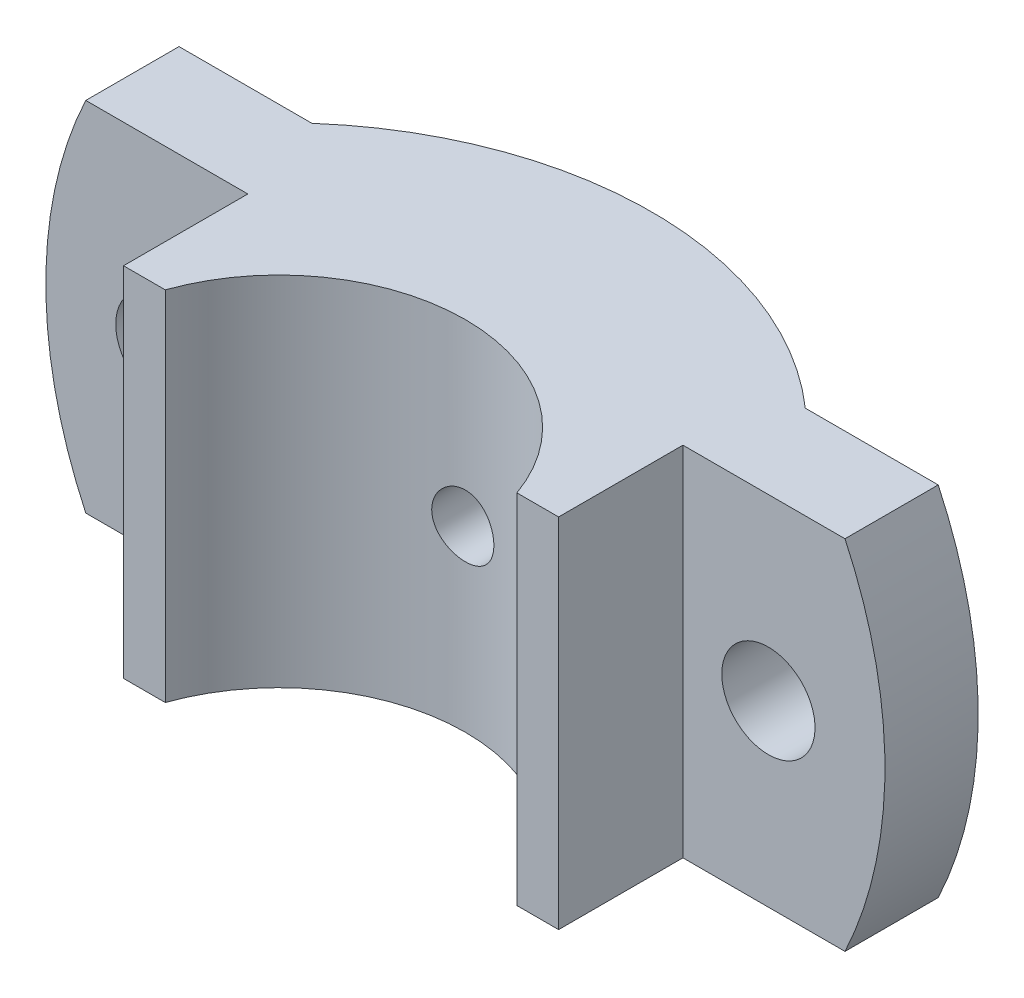
ISO-10303-21;
HEADER;
FILE_DESCRIPTION(('STEP AP214'),'2;1');
FILE_NAME('part.step','',(''),(''),'','','');
FILE_SCHEMA(('AUTOMOTIVE_DESIGN { 1 0 10303 214 1 1 1 1 }'));
ENDSEC;
DATA;
#1=APPLICATION_CONTEXT('core data for automotive mechanical design processes');
#2=APPLICATION_PROTOCOL_DEFINITION('international standard','automotive_design',2000,#1);
#3=PRODUCT_CONTEXT('',#1,'mechanical');
#4=PRODUCT('Part','Part','',(#3));
#5=PRODUCT_RELATED_PRODUCT_CATEGORY('part','',(#4));
#6=PRODUCT_DEFINITION_FORMATION('','',#4);
#7=PRODUCT_DEFINITION_CONTEXT('part definition',#1,'design');
#8=PRODUCT_DEFINITION('design','',#6,#7);
#9=PRODUCT_DEFINITION_SHAPE('','',#8);
#10=(LENGTH_UNIT() NAMED_UNIT(*) SI_UNIT(.MILLI.,.METRE.));
#11=(NAMED_UNIT(*) PLANE_ANGLE_UNIT() SI_UNIT($,.RADIAN.));
#12=(NAMED_UNIT(*) SI_UNIT($,.STERADIAN.) SOLID_ANGLE_UNIT());
#13=UNCERTAINTY_MEASURE_WITH_UNIT(LENGTH_MEASURE(1.E-05),#10,'distance_accuracy_value','');
#14=(GEOMETRIC_REPRESENTATION_CONTEXT(3) GLOBAL_UNCERTAINTY_ASSIGNED_CONTEXT((#13)) GLOBAL_UNIT_ASSIGNED_CONTEXT((#10,
#11,#12)) REPRESENTATION_CONTEXT('',''));
#15=CARTESIAN_POINT('',(0.,0.,0.));
#16=DIRECTION('',(0.,0.,1.));
#17=DIRECTION('',(1.,0.,0.));
#18=AXIS2_PLACEMENT_3D('',#15,#16,#17);
#19=CARTESIAN_POINT('',(0.,46.,24.));
#20=DIRECTION('',(0.,-1.,0.));
#21=DIRECTION('',(0.,0.,-1.));
#22=AXIS2_PLACEMENT_3D('',#19,#20,#21);
#23=CYLINDRICAL_SURFACE('',#22,48.);
#24=CARTESIAN_POINT('',(-4.,23.,-23.8330429724056));
#25=CARTESIAN_POINT('',(-3.99999020332116,22.7757371648324,-23.8330451840851));
#26=CARTESIAN_POINT('',(-3.98107636783619,22.5513216553513,-23.8346371180517));
#27=CARTESIAN_POINT('',(-3.90590391629408,22.1086999186096,-23.8408327886665));
#28=CARTESIAN_POINT('',(-3.84960298544633,21.8905010194862,-23.8454399378559));
#29=CARTESIAN_POINT('',(-3.7012959389513,21.4667872155045,-23.8571406201895));
#30=CARTESIAN_POINT('',(-3.60931006550243,21.2612651961817,-23.8642327435177));
#31=CARTESIAN_POINT('',(-3.39228027394151,20.8686272191588,-23.8801025079712));
#32=CARTESIAN_POINT('',(-3.26724342325069,20.6815073381794,-23.888879788643));
#33=CARTESIAN_POINT('',(-2.98731414583224,20.3304559877338,-23.9071561912045));
#34=CARTESIAN_POINT('',(-2.83235440560754,20.1665782725483,-23.9166569107679));
#35=CARTESIAN_POINT('',(-2.49712048270436,19.8671249350478,-23.9352950644242));
#36=CARTESIAN_POINT('',(-2.31684519461471,19.7315505492496,-23.9444324826311));
#37=CARTESIAN_POINT('',(-1.93577698123517,19.4923735413753,-23.9613296203025));
#38=CARTESIAN_POINT('',(-1.73495476850345,19.3888174272742,-23.9690873287984));
#39=CARTESIAN_POINT('',(-1.31869760199506,19.216914035526,-23.982333750891));
#40=CARTESIAN_POINT('',(-1.10326290406465,19.1485661416072,-23.9878225042024));
#41=CARTESIAN_POINT('',(-0.664431183791251,19.0491740645759,-23.9959014181069));
#42=CARTESIAN_POINT('',(-0.441053984929293,19.0180429155222,-23.9984983351981));
#43=CARTESIAN_POINT('',(0.00776912755926946,18.9936991872616,-24.000523869369));
#44=CARTESIAN_POINT('',(0.233215002638186,19.0004859029204,-23.9999525453664));
#45=CARTESIAN_POINT('',(0.679186206075251,19.0517141287175,-23.9957115455516));
#46=CARTESIAN_POINT('',(0.899722360289855,19.0960621192168,-23.9920495649012));
#47=CARTESIAN_POINT('',(1.33020986416097,19.2210086038483,-23.9820479941848));
#48=CARTESIAN_POINT('',(1.540161113086,19.3016074428902,-23.9757083786425));
#49=CARTESIAN_POINT('',(1.94381664254742,19.4968719484743,-23.9610515164917));
#50=CARTESIAN_POINT('',(2.13750057063589,19.611579498395,-23.9527318410145));
#51=CARTESIAN_POINT('',(2.50290134350947,19.8717748863145,-23.9350498107701));
#52=CARTESIAN_POINT('',(2.67461774259947,20.0172633486625,-23.9256874348549));
#53=CARTESIAN_POINT('',(2.99175585912758,20.335417759821,-23.9069385898908));
#54=CARTESIAN_POINT('',(3.1370960666601,20.5081649712752,-23.8975521341066));
#55=CARTESIAN_POINT('',(3.39672639569081,20.8756500204653,-23.8798416708951));
#56=CARTESIAN_POINT('',(3.51101649159326,21.0703878763287,-23.8715176643437));
#57=CARTESIAN_POINT('',(3.705299218373,21.4763835510872,-23.8568730438794));
#58=CARTESIAN_POINT('',(3.7852876189388,21.6876434037876,-23.8505526770937));
#59=CARTESIAN_POINT('',(3.90863602811403,22.120658872204,-23.8406357311993));
#60=CARTESIAN_POINT('',(3.95199680677921,22.3424142671592,-23.8370390948273));
#61=CARTESIAN_POINT('',(4.00075593165047,22.7894127462212,-23.8329861158614));
#62=CARTESIAN_POINT('',(4.00626794447155,23.0146433497875,-23.8325203707296));
#63=CARTESIAN_POINT('',(3.97947082017928,23.4628253745985,-23.8347570885527));
#64=CARTESIAN_POINT('',(3.94716203583528,23.6857768170822,-23.8374595219568));
#65=CARTESIAN_POINT('',(3.84573520496992,24.1227454231982,-23.8457195257899));
#66=CARTESIAN_POINT('',(3.7766702039578,24.3367749838524,-23.8512729812989));
#67=CARTESIAN_POINT('',(3.60374536891936,24.750208328655,-23.8646058791845));
#68=CARTESIAN_POINT('',(3.49988497658827,24.9496118780611,-23.8723853572783));
#69=CARTESIAN_POINT('',(3.26002995191579,25.328653008877,-23.8893165385274));
#70=CARTESIAN_POINT('',(3.12395957474015,25.5082425135937,-23.8984714573364));
#71=CARTESIAN_POINT('',(2.82365651366203,25.8420717636273,-23.9171111109512));
#72=CARTESIAN_POINT('',(2.65942334515707,25.9963110726493,-23.9265958514302));
#73=CARTESIAN_POINT('',(2.30696549164698,26.2754496230802,-23.9448544443531));
#74=CARTESIAN_POINT('',(2.11868220963932,26.4002750120125,-23.953626471923));
#75=CARTESIAN_POINT('',(1.72376077285762,26.6165356542582,-23.9694449548423));
#76=CARTESIAN_POINT('',(1.51712280152711,26.7079712412348,-23.9764914274349));
#77=CARTESIAN_POINT('',(1.09162231506815,26.8547299296643,-23.988056448774));
#78=CARTESIAN_POINT('',(0.872775642082424,26.9100987005834,-23.9925781934066));
#79=CARTESIAN_POINT('',(0.428852716265195,26.9833013030164,-23.9985972531933));
#80=CARTESIAN_POINT('',(0.203776581431312,27.0011358450063,-24.000094625595));
#81=CARTESIAN_POINT('',(-0.245488193583607,26.9987554415961,-23.9998963149351));
#82=CARTESIAN_POINT('',(-0.469677456845539,26.9786555926458,-23.998210290587));
#83=CARTESIAN_POINT('',(-0.911484448245339,26.9012169819538,-23.9918537358221));
#84=CARTESIAN_POINT('',(-1.12910216745714,26.8438781696331,-23.9871832013517));
#85=CARTESIAN_POINT('',(-1.55159618579498,26.6936185195106,-23.9753816681559));
#86=CARTESIAN_POINT('',(-1.75647322448097,26.6006997492684,-23.9682508124027));
#87=CARTESIAN_POINT('',(-2.14773829159616,26.3819310184091,-23.9523263984375));
#88=CARTESIAN_POINT('',(-2.3341266123445,26.2560815785626,-23.9435328665199));
#89=CARTESIAN_POINT('',(-2.68371235770156,25.9745919406043,-23.9252383400434));
#90=CARTESIAN_POINT('',(-2.84684110393744,25.8188665786162,-23.9157353716578));
#91=CARTESIAN_POINT('',(-3.1447113062392,25.4821993250938,-23.8971097992901));
#92=CARTESIAN_POINT('',(-3.27944587779673,25.3012513356597,-23.8879872879835));
#93=CARTESIAN_POINT('',(-3.5168855159125,24.9189239972036,-23.8711369760421));
#94=CARTESIAN_POINT('',(-3.61953009382115,24.7175070000248,-23.863411820789));
#95=CARTESIAN_POINT('',(-3.78941160372255,24.3003702530915,-23.850263183119));
#96=CARTESIAN_POINT('',(-3.85668924371504,24.0846672703388,-23.8448370558809));
#97=CARTESIAN_POINT('',(-3.9367923920259,23.7230764630875,-23.838296327659));
#98=CARTESIAN_POINT('',(-3.96046373623408,23.5795141888843,-23.8363353755559));
#99=CARTESIAN_POINT('',(-3.99207069402631,23.290655987302,-23.8337079828982));
#100=CARTESIAN_POINT('',(-4.00000634989685,23.1453600645828,-23.833041538865));
#101=CARTESIAN_POINT('',(-4.,23.,-23.8330429724056));
#102=B_SPLINE_CURVE_WITH_KNOTS('',3,(#24,#25,#26,#27,#28,#29,#30,#31,#32,#33,#34,#35,#36,#37,
#38,#39,#40,#41,#42,#43,#44,#45,#46,#47,#48,#49,#50,#51,#52,#53,#54,#55,#56,#57,#58,#59,#60,#61,
#62,#63,#64,#65,#66,#67,#68,#69,#70,#71,#72,#73,#74,#75,#76,#77,#78,#79,#80,#81,#82,#83,#84,#85,
#86,#87,#88,#89,#90,#91,#92,#93,#94,#95,#96,#97,#98,#99,#100,#101),.UNSPECIFIED.,.T.,.F.,(4,2,2,
2,2,2,2,2,2,2,2,2,2,2,2,2,2,2,2,2,2,2,2,2,2,2,2,2,2,2,2,2,2,2,2,2,2,2,4),(0.,0.672257768211029,
1.3452776988855,2.01791641752559,2.69041141936011,3.3644372475838,4.03849251650884,
4.7135223304357,5.38854032848792,6.06197788089772,6.73540290986099,7.40715616500414,
8.07891581169583,8.75150376805701,9.42410536826671,10.098751360929,10.7733979097251,
11.448127636476,12.1228431774185,12.7955315372131,13.4682136226307,14.1399275348091,
14.8116522253986,15.484972513737,16.1583043891882,16.8333092694962,17.5083074043153,
18.182449155257,18.8565781454246,19.5286650535126,20.2007528744488,20.87280164613,
21.5448397905717,22.2188228929646,22.892969223112,23.5683787415706,24.2430091395232,
24.6787464971319,25.1144826837828),.UNSPECIFIED.);
#103=CARTESIAN_POINT('',(-4.,23.,-23.8330429724056));
#104=VERTEX_POINT('',#103);
#105=EDGE_CURVE('E145',#104,#104,#102,.T.);
#106=ORIENTED_EDGE('',*,*,#105,.T.);
#107=EDGE_LOOP('',(#106));
#108=FACE_BOUND('',#107,.T.);
#109=CARTESIAN_POINT('',(31.7490157327751,7.62393980382305,-12.));
#110=CARTESIAN_POINT('',(31.5666993606049,7.70991687292433,-12.1607910344816));
#111=CARTESIAN_POINT('',(31.3842407385664,7.79992356782301,-12.3192382806886));
#112=CARTESIAN_POINT('',(31.0194382984914,7.98824476927104,-12.6312986785064));
#113=CARTESIAN_POINT('',(30.83709449581,8.08656021623286,-12.7849112802083));
#114=CARTESIAN_POINT('',(30.2906545114745,8.39444840414579,-13.2384242405059));
#115=CARTESIAN_POINT('',(29.9273932433292,8.61684933510149,-13.5307855559239));
#116=CARTESIAN_POINT('',(29.2055877678829,9.09825010824212,-14.0952057641667));
#117=CARTESIAN_POINT('',(28.8470773519233,9.35743198365531,-14.3671527207169));
#118=CARTESIAN_POINT('',(28.1414563178619,9.91209322117403,-14.8876660950044));
#119=CARTESIAN_POINT('',(27.7943424142725,10.2075620036307,-15.1362392903486));
#120=CARTESIAN_POINT('',(27.1144372728569,10.8365659071297,-15.6103537782901));
#121=CARTESIAN_POINT('',(26.7817440960143,11.1703180960102,-15.8357484531289));
#122=CARTESIAN_POINT('',(26.1381758530123,11.8734281889072,-16.2609560521935));
#123=CARTESIAN_POINT('',(25.8273031949563,12.2427900121454,-16.4607661549158));
#124=CARTESIAN_POINT('',(25.2335249148575,13.01399375225,-16.8337098769773));
#125=CARTESIAN_POINT('',(24.9505424988563,13.4157406115369,-17.0069175240426));
#126=CARTESIAN_POINT('',(24.4165226257608,14.2497280213662,-17.3271148139075));
#127=CARTESIAN_POINT('',(24.165480267083,14.681963877144,-17.4741084809499));
#128=CARTESIAN_POINT('',(23.7269538102758,15.5212678567218,-17.7263466257883));
#129=CARTESIAN_POINT('',(23.535471816767,15.9253930890386,-17.8344606926746));
#130=CARTESIAN_POINT('',(23.1835604410674,16.7516546435088,-18.0305023424913));
#131=CARTESIAN_POINT('',(23.0231288276401,17.1737896688415,-18.1184313759742));
#132=CARTESIAN_POINT('',(22.7354708993115,18.0330593307288,-18.2744033380662));
#133=CARTESIAN_POINT('',(22.608263014144,18.4702021408734,-18.3424352319097));
#134=CARTESIAN_POINT('',(22.3889311500727,19.3557653801655,-18.4588178093571));
#135=CARTESIAN_POINT('',(22.2968060905276,19.8041854614902,-18.5071690991774));
#136=CARTESIAN_POINT('',(22.1535573681311,20.6801355748953,-18.5819913104556));
#137=CARTESIAN_POINT('',(22.1002179585565,21.1072039547406,-18.6096478774008));
#138=CARTESIAN_POINT('',(22.0260840023336,21.9648989915092,-18.6480173220226));
#139=CARTESIAN_POINT('',(22.0052877863416,22.3955254647765,-18.6587310688027));
#140=CARTESIAN_POINT('',(21.9964874817101,23.2570337519885,-18.6632694542849));
#141=CARTESIAN_POINT('',(22.0084707600267,23.6879154035977,-18.6571005994522));
#142=CARTESIAN_POINT('',(22.065059537599,24.5469567479689,-18.6278566152432));
#143=CARTESIAN_POINT('',(22.1096651361626,24.9751164324407,-18.6047814344012));
#144=CARTESIAN_POINT('',(22.2301596888934,25.8199476406009,-18.5420325739506));
#145=CARTESIAN_POINT('',(22.3056259308811,26.2366962152239,-18.5025830752487));
#146=CARTESIAN_POINT('',(22.4869158657054,27.0615720498306,-18.4069464217796));
#147=CARTESIAN_POINT('',(22.5927390819871,27.4696994450449,-18.3507595297616));
#148=CARTESIAN_POINT('',(22.8334963082055,28.2745223886822,-18.2214412118201));
#149=CARTESIAN_POINT('',(22.968430619134,28.6712178188572,-18.1483096106976));
#150=CARTESIAN_POINT('',(23.2658059297839,29.4505094660615,-17.9848905587104));
#151=CARTESIAN_POINT('',(23.4282471429062,29.8331055736788,-17.8946029747475));
#152=CARTESIAN_POINT('',(23.7802108235912,30.5849716873719,-17.6958360657888));
#153=CARTESIAN_POINT('',(23.9699550727257,30.9540980563005,-17.5872063549857));
#154=CARTESIAN_POINT('',(24.3731485080022,31.6732437269405,-17.3521952355227));
#155=CARTESIAN_POINT('',(24.5865977528721,32.023262981312,-17.2258137828836));
#156=CARTESIAN_POINT('',(25.0346129932482,32.7022362238959,-16.955299887438));
#157=CARTESIAN_POINT('',(25.2691774101921,33.0311917836809,-16.8111687712936));
#158=CARTESIAN_POINT('',(25.7566603032743,33.6665029899036,-16.5052741270817));
#159=CARTESIAN_POINT('',(26.0095789285025,33.9728584527217,-16.3435104557808));
#160=CARTESIAN_POINT('',(26.5418842805157,34.574253346598,-15.9954208539865));
#161=CARTESIAN_POINT('',(26.8219376643438,34.8682688661706,-15.8083462352715));
#162=CARTESIAN_POINT('',(27.3955194624364,35.4296869015499,-15.4158125971757));
#163=CARTESIAN_POINT('',(27.6890490642933,35.6970870652738,-15.2103519560057));
#164=CARTESIAN_POINT('',(28.2863824379904,36.2050051767951,-14.7816416595243));
#165=CARTESIAN_POINT('',(28.5901897214681,36.4455138130625,-14.5583858879776));
#166=CARTESIAN_POINT('',(29.2047776474053,36.8996257253554,-14.0950011657593));
#167=CARTESIAN_POINT('',(29.515556781803,37.113234755093,-13.8548758405909));
#168=CARTESIAN_POINT('',(30.1465409740783,37.5175420543303,-13.3543930550497));
#169=CARTESIAN_POINT('',(30.4668164417767,37.7077886938376,-13.0937608790559));
#170=CARTESIAN_POINT('',(31.1079315091614,38.0615091701432,-12.5577863535064));
#171=CARTESIAN_POINT('',(31.4287665224092,38.2250617322872,-12.282490555825));
#172=CARTESIAN_POINT('',(31.7490157327751,38.376060196177,-12.));
#173=B_SPLINE_CURVE_WITH_KNOTS('',3,(#109,#110,#111,#112,#113,#114,#115,#116,#117,#118,#119,
#120,#121,#122,#123,#124,#125,#126,#127,#128,#129,#130,#131,#132,#133,#134,#135,#136,#137,#138,
#139,#140,#141,#142,#143,#144,#145,#146,#147,#148,#149,#150,#151,#152,#153,#154,#155,#156,#157,
#158,#159,#160,#161,#162,#163,#164,#165,#166,#167,#168,#169,#170,#171,#172),.UNSPECIFIED.,.F.,
.F.,(4,2,2,2,2,2,2,2,2,2,2,2,2,2,2,2,2,2,2,2,2,2,2,2,2,2,2,2,2,2,2,4),(0.,0.773458025682372,
1.5470037114875,3.09512332277502,4.65119082007948,6.20680570955184,7.77172305062614,
9.33681282467528,10.8974652129592,12.4578778108564,13.8363264835486,15.2146760660573,
16.5937886249588,17.9728587002062,19.2651269606079,20.5573289303254,21.8490329624022,
23.1407409266611,24.4153187748838,25.6898766154092,26.9644476347566,28.2390285427914,
29.5246179289053,30.8102105000725,32.0957070405173,33.381214024115,34.7209972321288,
36.060898736084,37.4012627703214,38.7413396176214,40.1042161588979,41.4629977344696),.UNSPECIFIED.);
#174=CARTESIAN_POINT('',(31.7490157327751,7.62393980382304,-12.));
#175=VERTEX_POINT('',#174);
#176=CARTESIAN_POINT('',(31.7490157327751,38.376060196177,-12.));
#177=VERTEX_POINT('',#176);
#178=EDGE_CURVE('E11',#175,#177,#173,.T.);
#179=ORIENTED_EDGE('',*,*,#178,.F.);
#180=DIRECTION('',(0.,-1.,0.));
#181=VECTOR('',#180,1.);
#182=CARTESIAN_POINT('',(31.7490157327751,46.,-12.));
#183=LINE('',#182,#181);
#184=CARTESIAN_POINT('',(31.7490157327751,0.,-12.));
#185=VERTEX_POINT('',#184);
#186=EDGE_CURVE('E150',#175,#185,#183,.T.);
#187=ORIENTED_EDGE('',*,*,#186,.T.);
#188=CARTESIAN_POINT('',(0.,0.,24.));
#189=DIRECTION('',(0.,1.,0.));
#190=DIRECTION('',(0.,0.,1.));
#191=AXIS2_PLACEMENT_3D('',#188,#189,#190);
#192=CIRCLE('',#191,48.);
#193=CARTESIAN_POINT('',(-31.7490157327751,0.,-12.));
#194=VERTEX_POINT('',#193);
#195=EDGE_CURVE('E285',#185,#194,#192,.T.);
#196=ORIENTED_EDGE('',*,*,#195,.T.);
#197=DIRECTION('',(0.,-1.,0.));
#198=VECTOR('',#197,1.);
#199=CARTESIAN_POINT('',(-31.7490157327751,46.,-12.));
#200=LINE('',#199,#198);
#201=CARTESIAN_POINT('',(-31.7490157327751,7.62393980382305,-12.));
#202=VERTEX_POINT('',#201);
#203=EDGE_CURVE('E160',#202,#194,#200,.T.);
#204=ORIENTED_EDGE('',*,*,#203,.F.);
#205=CARTESIAN_POINT('',(-31.7490157327751,7.62393980382305,-12.));
#206=CARTESIAN_POINT('',(-31.5666993606049,7.70991687292433,-12.1607910344816));
#207=CARTESIAN_POINT('',(-31.3842407385664,7.79992356782301,-12.3192382806885));
#208=CARTESIAN_POINT('',(-31.0194382984914,7.98824476927105,-12.6312986785064));
#209=CARTESIAN_POINT('',(-30.83709449581,8.08656021623286,-12.7849112802083));
#210=CARTESIAN_POINT('',(-30.2906545114744,8.39444840414579,-13.2384242405059));
#211=CARTESIAN_POINT('',(-29.9273932433292,8.6168493351015,-13.5307855559239));
#212=CARTESIAN_POINT('',(-29.2055877678829,9.09825010824212,-14.0952057641667));
#213=CARTESIAN_POINT('',(-28.8470773519233,9.35743198365532,-14.3671527207169));
#214=CARTESIAN_POINT('',(-28.1414563178619,9.91209322117404,-14.8876660950044));
#215=CARTESIAN_POINT('',(-27.7943424142725,10.2075620036308,-15.1362392903486));
#216=CARTESIAN_POINT('',(-27.1144372728569,10.8365659071297,-15.6103537782901));
#217=CARTESIAN_POINT('',(-26.7817440960143,11.1703180960103,-15.8357484531289));
#218=CARTESIAN_POINT('',(-26.1381758530123,11.8734281889072,-16.2609560521935));
#219=CARTESIAN_POINT('',(-25.8273031949563,12.2427900121454,-16.4607661549158));
#220=CARTESIAN_POINT('',(-25.2335249148575,13.01399375225,-16.8337098769773));
#221=CARTESIAN_POINT('',(-24.9505424988563,13.4157406115369,-17.0069175240426));
#222=CARTESIAN_POINT('',(-24.4165226257608,14.2497280213662,-17.3271148139075));
#223=CARTESIAN_POINT('',(-24.165480267083,14.681963877144,-17.4741084809499));
#224=CARTESIAN_POINT('',(-23.7269538102758,15.5212678567218,-17.7263466257883));
#225=CARTESIAN_POINT('',(-23.535471816767,15.9253930890386,-17.8344606926746));
#226=CARTESIAN_POINT('',(-23.1835604410674,16.7516546435088,-18.0305023424913));
#227=CARTESIAN_POINT('',(-23.0231288276401,17.1737896688416,-18.1184313759742));
#228=CARTESIAN_POINT('',(-22.7354708993115,18.0330593307288,-18.2744033380662));
#229=CARTESIAN_POINT('',(-22.608263014144,18.4702021408734,-18.3424352319097));
#230=CARTESIAN_POINT('',(-22.3889311500727,19.3557653801655,-18.4588178093571));
#231=CARTESIAN_POINT('',(-22.2968060905276,19.8041854614903,-18.5071690991774));
#232=CARTESIAN_POINT('',(-22.1535573681311,20.6801355748953,-18.5819913104556));
#233=CARTESIAN_POINT('',(-22.1002179585565,21.1072039547406,-18.6096478774008));
#234=CARTESIAN_POINT('',(-22.0260840023336,21.9648989915092,-18.6480173220226));
#235=CARTESIAN_POINT('',(-22.0052877863416,22.3955254647765,-18.6587310688027));
#236=CARTESIAN_POINT('',(-21.9964874817101,23.2570337519886,-18.6632694542849));
#237=CARTESIAN_POINT('',(-22.0084707600267,23.6879154035977,-18.6571005994522));
#238=CARTESIAN_POINT('',(-22.065059537599,24.5469567479689,-18.6278566152432));
#239=CARTESIAN_POINT('',(-22.1096651361626,24.9751164324408,-18.6047814344012));
#240=CARTESIAN_POINT('',(-22.2301596888934,25.8199476406009,-18.5420325739506));
#241=CARTESIAN_POINT('',(-22.3056259308811,26.2366962152239,-18.5025830752487));
#242=CARTESIAN_POINT('',(-22.4869158657054,27.0615720498307,-18.4069464217796));
#243=CARTESIAN_POINT('',(-22.5927390819871,27.4696994450449,-18.3507595297616));
#244=CARTESIAN_POINT('',(-22.8334963082055,28.2745223886822,-18.2214412118201));
#245=CARTESIAN_POINT('',(-22.968430619134,28.6712178188573,-18.1483096106976));
#246=CARTESIAN_POINT('',(-23.2658059297839,29.4505094660615,-17.9848905587104));
#247=CARTESIAN_POINT('',(-23.4282471429062,29.8331055736788,-17.8946029747475));
#248=CARTESIAN_POINT('',(-23.7802108235912,30.584971687372,-17.6958360657888));
#249=CARTESIAN_POINT('',(-23.9699550727257,30.9540980563005,-17.5872063549857));
#250=CARTESIAN_POINT('',(-24.3731485080022,31.6732437269406,-17.3521952355227));
#251=CARTESIAN_POINT('',(-24.5865977528721,32.023262981312,-17.2258137828836));
#252=CARTESIAN_POINT('',(-25.0346129932482,32.7022362238959,-16.9552998874379));
#253=CARTESIAN_POINT('',(-25.2691774101921,33.031191783681,-16.8111687712936));
#254=CARTESIAN_POINT('',(-25.7566603032743,33.6665029899036,-16.5052741270816));
#255=CARTESIAN_POINT('',(-26.0095789285025,33.9728584527217,-16.3435104557808));
#256=CARTESIAN_POINT('',(-26.5418842805158,34.574253346598,-15.9954208539865));
#257=CARTESIAN_POINT('',(-26.8219376643438,34.8682688661706,-15.8083462352715));
#258=CARTESIAN_POINT('',(-27.3955194624364,35.42968690155,-15.4158125971757));
#259=CARTESIAN_POINT('',(-27.6890490642933,35.6970870652738,-15.2103519560056));
#260=CARTESIAN_POINT('',(-28.2863824379904,36.2050051767951,-14.7816416595243));
#261=CARTESIAN_POINT('',(-28.5901897214681,36.4455138130625,-14.5583858879776));
#262=CARTESIAN_POINT('',(-29.2047776474053,36.8996257253554,-14.0950011657592));
#263=CARTESIAN_POINT('',(-29.515556781803,37.113234755093,-13.8548758405909));
#264=CARTESIAN_POINT('',(-30.1465409740783,37.5175420543304,-13.3543930550497));
#265=CARTESIAN_POINT('',(-30.4668164417767,37.7077886938376,-13.0937608790559));
#266=CARTESIAN_POINT('',(-31.1079315091614,38.0615091701432,-12.5577863535064));
#267=CARTESIAN_POINT('',(-31.4287665224092,38.2250617322872,-12.282490555825));
#268=CARTESIAN_POINT('',(-31.7490157327751,38.3760601961769,-12.));
#269=B_SPLINE_CURVE_WITH_KNOTS('',3,(#205,#206,#207,#208,#209,#210,#211,#212,#213,#214,#215,
#216,#217,#218,#219,#220,#221,#222,#223,#224,#225,#226,#227,#228,#229,#230,#231,#232,#233,#234,
#235,#236,#237,#238,#239,#240,#241,#242,#243,#244,#245,#246,#247,#248,#249,#250,#251,#252,#253,
#254,#255,#256,#257,#258,#259,#260,#261,#262,#263,#264,#265,#266,#267,#268),.UNSPECIFIED.,.F.,
.F.,(4,2,2,2,2,2,2,2,2,2,2,2,2,2,2,2,2,2,2,2,2,2,2,2,2,2,2,2,2,2,2,4),(0.,0.773458025682373,
1.5470037114875,3.09512332277503,4.65119082007948,6.20680570955184,7.77172305062615,
9.33681282467529,10.8974652129592,12.4578778108564,13.8363264835486,15.2146760660573,
16.5937886249588,17.9728587002062,19.2651269606079,20.5573289303254,21.8490329624022,
23.1407409266611,24.4153187748838,25.6898766154092,26.9644476347566,28.2390285427914,
29.5246179289053,30.8102105000726,32.0957070405173,33.381214024115,34.7209972321288,
36.060898736084,37.4012627703214,38.7413396176214,40.104216158898,41.4629977344696),.UNSPECIFIED.);
#270=CARTESIAN_POINT('',(-31.7490157327751,38.3760601961769,-12.));
#271=VERTEX_POINT('',#270);
#272=EDGE_CURVE('E51',#202,#271,#269,.T.);
#273=ORIENTED_EDGE('',*,*,#272,.T.);
#274=CARTESIAN_POINT('',(-31.7490157327751,46.,-12.));
#275=VERTEX_POINT('',#274);
#276=EDGE_CURVE('E157',#275,#271,#200,.T.);
#277=ORIENTED_EDGE('',*,*,#276,.F.);
#278=CARTESIAN_POINT('',(0.,46.,24.));
#279=DIRECTION('',(0.,1.,0.));
#280=DIRECTION('',(0.,0.,1.));
#281=AXIS2_PLACEMENT_3D('',#278,#279,#280);
#282=CIRCLE('',#281,48.);
#283=CARTESIAN_POINT('',(31.7490157327751,46.,-12.));
#284=VERTEX_POINT('',#283);
#285=EDGE_CURVE('E313',#284,#275,#282,.T.);
#286=ORIENTED_EDGE('',*,*,#285,.F.);
#287=EDGE_CURVE('E153',#284,#177,#183,.T.);
#288=ORIENTED_EDGE('',*,*,#287,.T.);
#289=EDGE_LOOP('',(#179,#187,#196,#204,#273,#277,#286,#288));
#290=FACE_BOUND('',#289,.T.);
#291=ADVANCED_FACE('F37',(#108,#290),#23,.T.);
#292=CARTESIAN_POINT('',(-54.,46.,0.));
#293=DIRECTION('',(0.,0.,-1.));
#294=DIRECTION('',(-1.,0.,0.));
#295=AXIS2_PLACEMENT_3D('',#292,#293,#294);
#296=PLANE('',#295);
#297=DIRECTION('',(1.,0.,0.));
#298=VECTOR('',#297,1.);
#299=CARTESIAN_POINT('',(-54.,46.,0.));
#300=LINE('',#299,#298);
#301=CARTESIAN_POINT('',(-48.8569340012244,46.,0.));
#302=VERTEX_POINT('',#301);
#303=CARTESIAN_POINT('',(-28.,46.,0.));
#304=VERTEX_POINT('',#303);
#305=EDGE_CURVE('E287',#302,#304,#300,.T.);
#306=ORIENTED_EDGE('',*,*,#305,.F.);
#307=CARTESIAN_POINT('',(0.,23.,0.));
#308=DIRECTION('',(0.,0.,-1.));
#309=DIRECTION('',(-1.,0.,0.));
#310=AXIS2_PLACEMENT_3D('',#307,#308,#309);
#311=CIRCLE('',#310,54.);
#312=CARTESIAN_POINT('',(-48.8569340012244,0.,0.));
#313=VERTEX_POINT('',#312);
#314=EDGE_CURVE('E328',#313,#302,#311,.T.);
#315=ORIENTED_EDGE('',*,*,#314,.F.);
#316=DIRECTION('',(1.,0.,0.));
#317=VECTOR('',#316,1.);
#318=CARTESIAN_POINT('',(-54.,0.,0.));
#319=LINE('',#318,#317);
#320=CARTESIAN_POINT('',(-28.,0.,0.));
#321=VERTEX_POINT('',#320);
#322=EDGE_CURVE('E317',#313,#321,#319,.T.);
#323=ORIENTED_EDGE('',*,*,#322,.T.);
#324=DIRECTION('',(0.,-1.,0.));
#325=VECTOR('',#324,1.);
#326=CARTESIAN_POINT('',(-28.,46.,0.));
#327=LINE('',#326,#325);
#328=EDGE_CURVE('E178',#304,#321,#327,.T.);
#329=ORIENTED_EDGE('',*,*,#328,.F.);
#330=EDGE_LOOP('',(#306,#315,#323,#329));
#331=FACE_BOUND('',#330,.T.);
#332=CARTESIAN_POINT('',(-39.,23.,0.));
#333=DIRECTION('',(0.,0.,-1.));
#334=DIRECTION('',(-1.,0.,0.));
#335=AXIS2_PLACEMENT_3D('',#332,#333,#334);
#336=CIRCLE('',#335,5.99999999999999);
#337=CARTESIAN_POINT('',(-45.,23.,0.));
#338=VERTEX_POINT('',#337);
#339=EDGE_CURVE('E339',#338,#338,#336,.F.);
#340=ORIENTED_EDGE('',*,*,#339,.F.);
#341=EDGE_LOOP('',(#340));
#342=FACE_BOUND('',#341,.T.);
#343=ADVANCED_FACE('F39',(#331,#342),#296,.F.);
#344=CARTESIAN_POINT('',(28.,46.,0.));
#345=DIRECTION('',(0.,0.,-1.));
#346=DIRECTION('',(-1.,0.,0.));
#347=AXIS2_PLACEMENT_3D('',#344,#345,#346);
#348=PLANE('',#347);
#349=CARTESIAN_POINT('',(39.,23.,0.));
#350=DIRECTION('',(0.,0.,-1.));
#351=DIRECTION('',(-1.,0.,0.));
#352=AXIS2_PLACEMENT_3D('',#349,#350,#351);
#353=CIRCLE('',#352,5.99999999999999);
#354=CARTESIAN_POINT('',(33.,23.,0.));
#355=VERTEX_POINT('',#354);
#356=EDGE_CURVE('E335',#355,#355,#353,.T.);
#357=ORIENTED_EDGE('',*,*,#356,.T.);
#358=EDGE_LOOP('',(#357));
#359=FACE_BOUND('',#358,.T.);
#360=DIRECTION('',(1.,0.,0.));
#361=VECTOR('',#360,1.);
#362=CARTESIAN_POINT('',(28.,0.,0.));
#363=LINE('',#362,#361);
#364=CARTESIAN_POINT('',(28.,0.,0.));
#365=VERTEX_POINT('',#364);
#366=CARTESIAN_POINT('',(48.8569340012244,0.,0.));
#367=VERTEX_POINT('',#366);
#368=EDGE_CURVE('E278',#365,#367,#363,.T.);
#369=ORIENTED_EDGE('',*,*,#368,.T.);
#370=CARTESIAN_POINT('',(0.,23.,0.));
#371=DIRECTION('',(0.,0.,-1.));
#372=DIRECTION('',(-1.,0.,0.));
#373=AXIS2_PLACEMENT_3D('',#370,#371,#372);
#374=CIRCLE('',#373,54.);
#375=CARTESIAN_POINT('',(48.8569340012244,46.,0.));
#376=VERTEX_POINT('',#375);
#377=EDGE_CURVE('E299',#376,#367,#374,.T.);
#378=ORIENTED_EDGE('',*,*,#377,.F.);
#379=DIRECTION('',(1.,0.,0.));
#380=VECTOR('',#379,1.);
#381=CARTESIAN_POINT('',(28.,46.,0.));
#382=LINE('',#381,#380);
#383=CARTESIAN_POINT('',(28.,46.,0.));
#384=VERTEX_POINT('',#383);
#385=EDGE_CURVE('E308',#384,#376,#382,.T.);
#386=ORIENTED_EDGE('',*,*,#385,.F.);
#387=DIRECTION('',(0.,-1.,0.));
#388=VECTOR('',#387,1.);
#389=CARTESIAN_POINT('',(28.,46.,0.));
#390=LINE('',#389,#388);
#391=EDGE_CURVE('E159',#384,#365,#390,.T.);
#392=ORIENTED_EDGE('',*,*,#391,.T.);
#393=EDGE_LOOP('',(#369,#378,#386,#392));
#394=FACE_BOUND('',#393,.T.);
#395=ADVANCED_FACE('F253',(#359,#394),#348,.F.);
#396=CARTESIAN_POINT('',(31.7490157327751,46.,-12.));
#397=DIRECTION('',(0.,0.,1.));
#398=DIRECTION('',(1.,0.,0.));
#399=AXIS2_PLACEMENT_3D('',#396,#397,#398);
#400=PLANE('',#399);
#401=CARTESIAN_POINT('',(39.,23.,-12.));
#402=DIRECTION('',(0.,0.,-1.));
#403=DIRECTION('',(-1.,0.,0.));
#404=AXIS2_PLACEMENT_3D('',#401,#402,#403);
#405=CIRCLE('',#404,5.99999999999999);
#406=CARTESIAN_POINT('',(33.,23.,-12.));
#407=VERTEX_POINT('',#406);
#408=EDGE_CURVE('E225',#407,#407,#405,.T.);
#409=ORIENTED_EDGE('',*,*,#408,.F.);
#410=EDGE_LOOP('',(#409));
#411=FACE_BOUND('',#410,.T.);
#412=DIRECTION('',(-1.,0.,0.));
#413=VECTOR('',#412,1.);
#414=CARTESIAN_POINT('',(31.7490157327751,0.,-12.));
#415=LINE('',#414,#413);
#416=CARTESIAN_POINT('',(48.8569340012244,0.,-12.));
#417=VERTEX_POINT('',#416);
#418=EDGE_CURVE('E156',#417,#185,#415,.T.);
#419=ORIENTED_EDGE('',*,*,#418,.T.);
#420=ORIENTED_EDGE('',*,*,#186,.F.);
#421=CARTESIAN_POINT('',(39.,23.,-12.));
#422=DIRECTION('',(0.,0.,-1.));
#423=DIRECTION('',(-1.,0.,0.));
#424=AXIS2_PLACEMENT_3D('',#421,#422,#423);
#425=CIRCLE('',#424,17.);
#426=EDGE_CURVE('E58',#175,#177,#425,.T.);
#427=ORIENTED_EDGE('',*,*,#426,.T.);
#428=ORIENTED_EDGE('',*,*,#287,.F.);
#429=DIRECTION('',(-1.,0.,0.));
#430=VECTOR('',#429,1.);
#431=CARTESIAN_POINT('',(31.7490157327751,46.,-12.));
#432=LINE('',#431,#430);
#433=CARTESIAN_POINT('',(48.8569340012244,46.,-12.));
#434=VERTEX_POINT('',#433);
#435=EDGE_CURVE('E311',#434,#284,#432,.T.);
#436=ORIENTED_EDGE('',*,*,#435,.F.);
#437=CARTESIAN_POINT('',(0.,23.,-12.));
#438=DIRECTION('',(0.,0.,-1.));
#439=DIRECTION('',(-1.,0.,0.));
#440=AXIS2_PLACEMENT_3D('',#437,#438,#439);
#441=CIRCLE('',#440,54.);
#442=EDGE_CURVE('E331',#434,#417,#441,.T.);
#443=ORIENTED_EDGE('',*,*,#442,.T.);
#444=EDGE_LOOP('',(#419,#420,#427,#428,#436,#443));
#445=FACE_BOUND('',#444,.T.);
#446=ADVANCED_FACE('F154',(#411,#445),#400,.F.);
#447=CARTESIAN_POINT('',(-54.,46.,-12.));
#448=DIRECTION('',(0.,0.,1.));
#449=DIRECTION('',(1.,0.,0.));
#450=AXIS2_PLACEMENT_3D('',#447,#448,#449);
#451=PLANE('',#450);
#452=CARTESIAN_POINT('',(-39.,23.,-12.));
#453=DIRECTION('',(0.,0.,-1.));
#454=DIRECTION('',(-1.,0.,0.));
#455=AXIS2_PLACEMENT_3D('',#452,#453,#454);
#456=CIRCLE('',#455,17.);
#457=EDGE_CURVE('E65',#202,#271,#456,.F.);
#458=ORIENTED_EDGE('',*,*,#457,.F.);
#459=ORIENTED_EDGE('',*,*,#203,.T.);
#460=DIRECTION('',(-1.,0.,0.));
#461=VECTOR('',#460,1.);
#462=CARTESIAN_POINT('',(-54.,0.,-12.));
#463=LINE('',#462,#461);
#464=CARTESIAN_POINT('',(-48.8569340012244,0.,-12.));
#465=VERTEX_POINT('',#464);
#466=EDGE_CURVE('E286',#194,#465,#463,.T.);
#467=ORIENTED_EDGE('',*,*,#466,.T.);
#468=CARTESIAN_POINT('',(0.,23.,-12.));
#469=DIRECTION('',(0.,0.,-1.));
#470=DIRECTION('',(-1.,0.,0.));
#471=AXIS2_PLACEMENT_3D('',#468,#469,#470);
#472=CIRCLE('',#471,54.);
#473=CARTESIAN_POINT('',(-48.8569340012244,46.,-12.));
#474=VERTEX_POINT('',#473);
#475=EDGE_CURVE('E332',#465,#474,#472,.T.);
#476=ORIENTED_EDGE('',*,*,#475,.T.);
#477=DIRECTION('',(-1.,0.,0.));
#478=VECTOR('',#477,1.);
#479=CARTESIAN_POINT('',(-54.,46.,-12.));
#480=LINE('',#479,#478);
#481=EDGE_CURVE('E315',#275,#474,#480,.T.);
#482=ORIENTED_EDGE('',*,*,#481,.F.);
#483=ORIENTED_EDGE('',*,*,#276,.T.);
#484=EDGE_LOOP('',(#458,#459,#467,#476,#482,#483));
#485=FACE_BOUND('',#484,.T.);
#486=CARTESIAN_POINT('',(-39.,23.,-12.));
#487=DIRECTION('',(0.,0.,-1.));
#488=DIRECTION('',(-1.,0.,0.));
#489=AXIS2_PLACEMENT_3D('',#486,#487,#488);
#490=CIRCLE('',#489,5.99999999999999);
#491=CARTESIAN_POINT('',(-45.,23.,-12.));
#492=VERTEX_POINT('',#491);
#493=EDGE_CURVE('E224',#492,#492,#490,.F.);
#494=ORIENTED_EDGE('',*,*,#493,.T.);
#495=EDGE_LOOP('',(#494));
#496=FACE_BOUND('',#495,.T.);
#497=ADVANCED_FACE('F350',(#485,#496),#451,.F.);
#498=CARTESIAN_POINT('',(0.,46.,24.));
#499=DIRECTION('',(0.,1.,0.));
#500=DIRECTION('',(0.,0.,1.));
#501=AXIS2_PLACEMENT_3D('',#498,#499,#500);
#502=PLANE('',#501);
#503=ORIENTED_EDGE('',*,*,#481,.T.);
#504=DIRECTION('',(0.,0.,-1.));
#505=VECTOR('',#504,1.);
#506=CARTESIAN_POINT('',(-48.8569340012244,46.,16.));
#507=LINE('',#506,#505);
#508=EDGE_CURVE('E189',#474,#302,#507,.F.);
#509=ORIENTED_EDGE('',*,*,#508,.T.);
#510=ORIENTED_EDGE('',*,*,#305,.T.);
#511=DIRECTION('',(0.,0.,1.));
#512=VECTOR('',#511,1.);
#513=CARTESIAN_POINT('',(-28.,46.,0.));
#514=LINE('',#513,#512);
#515=CARTESIAN_POINT('',(-28.,46.,16.));
#516=VERTEX_POINT('',#515);
#517=EDGE_CURVE('E291',#304,#516,#514,.T.);
#518=ORIENTED_EDGE('',*,*,#517,.T.);
#519=DIRECTION('',(1.,0.,0.));
#520=VECTOR('',#519,1.);
#521=CARTESIAN_POINT('',(-28.,46.,16.));
#522=LINE('',#521,#520);
#523=CARTESIAN_POINT('',(-22.6274169979695,46.,16.));
#524=VERTEX_POINT('',#523);
#525=EDGE_CURVE('E296',#516,#524,#522,.T.);
#526=ORIENTED_EDGE('',*,*,#525,.T.);
#527=CARTESIAN_POINT('',(0.,46.,24.));
#528=DIRECTION('',(0.,-1.,0.));
#529=DIRECTION('',(0.,0.,1.));
#530=AXIS2_PLACEMENT_3D('',#527,#528,#529);
#531=CIRCLE('',#530,24.);
#532=CARTESIAN_POINT('',(22.6274169979695,46.,16.));
#533=VERTEX_POINT('',#532);
#534=EDGE_CURVE('E303',#524,#533,#531,.T.);
#535=ORIENTED_EDGE('',*,*,#534,.T.);
#536=DIRECTION('',(1.,0.,0.));
#537=VECTOR('',#536,1.);
#538=CARTESIAN_POINT('',(22.6274169979695,46.,16.));
#539=LINE('',#538,#537);
#540=CARTESIAN_POINT('',(28.,46.,16.));
#541=VERTEX_POINT('',#540);
#542=EDGE_CURVE('E272',#533,#541,#539,.T.);
#543=ORIENTED_EDGE('',*,*,#542,.T.);
#544=DIRECTION('',(0.,0.,-1.));
#545=VECTOR('',#544,1.);
#546=CARTESIAN_POINT('',(28.,46.,0.));
#547=LINE('',#546,#545);
#548=EDGE_CURVE('E306',#541,#384,#547,.T.);
#549=ORIENTED_EDGE('',*,*,#548,.T.);
#550=ORIENTED_EDGE('',*,*,#385,.T.);
#551=DIRECTION('',(0.,0.,-1.));
#552=VECTOR('',#551,1.);
#553=CARTESIAN_POINT('',(48.8569340012244,46.,16.));
#554=LINE('',#553,#552);
#555=EDGE_CURVE('E183',#376,#434,#554,.T.);
#556=ORIENTED_EDGE('',*,*,#555,.T.);
#557=ORIENTED_EDGE('',*,*,#435,.T.);
#558=ORIENTED_EDGE('',*,*,#285,.T.);
#559=EDGE_LOOP('',(#503,#509,#510,#518,#526,#535,#543,#549,#550,#556,#557,#558));
#560=FACE_BOUND('',#559,.T.);
#561=ADVANCED_FACE('F245',(#560),#502,.T.);
#562=CARTESIAN_POINT('',(0.,0.,24.));
#563=DIRECTION('',(0.,1.,0.));
#564=DIRECTION('',(0.,0.,1.));
#565=AXIS2_PLACEMENT_3D('',#562,#563,#564);
#566=PLANE('',#565);
#567=DIRECTION('',(0.,0.,-1.));
#568=VECTOR('',#567,1.);
#569=CARTESIAN_POINT('',(48.8569340012244,0.,16.));
#570=LINE('',#569,#568);
#571=EDGE_CURVE('E186',#367,#417,#570,.T.);
#572=ORIENTED_EDGE('',*,*,#571,.F.);
#573=ORIENTED_EDGE('',*,*,#368,.F.);
#574=DIRECTION('',(0.,0.,-1.));
#575=VECTOR('',#574,1.);
#576=CARTESIAN_POINT('',(28.,0.,0.));
#577=LINE('',#576,#575);
#578=CARTESIAN_POINT('',(28.,0.,16.));
#579=VERTEX_POINT('',#578);
#580=EDGE_CURVE('E276',#579,#365,#577,.T.);
#581=ORIENTED_EDGE('',*,*,#580,.F.);
#582=DIRECTION('',(1.,0.,0.));
#583=VECTOR('',#582,1.);
#584=CARTESIAN_POINT('',(22.6274169979695,0.,16.));
#585=LINE('',#584,#583);
#586=CARTESIAN_POINT('',(22.6274169979695,0.,16.));
#587=VERTEX_POINT('',#586);
#588=EDGE_CURVE('E267',#587,#579,#585,.T.);
#589=ORIENTED_EDGE('',*,*,#588,.F.);
#590=CARTESIAN_POINT('',(0.,0.,24.));
#591=DIRECTION('',(0.,-1.,0.));
#592=DIRECTION('',(0.,0.,1.));
#593=AXIS2_PLACEMENT_3D('',#590,#591,#592);
#594=CIRCLE('',#593,24.);
#595=CARTESIAN_POINT('',(-22.6274169979695,0.,16.));
#596=VERTEX_POINT('',#595);
#597=EDGE_CURVE('E261',#596,#587,#594,.T.);
#598=ORIENTED_EDGE('',*,*,#597,.F.);
#599=DIRECTION('',(1.,0.,0.));
#600=VECTOR('',#599,1.);
#601=CARTESIAN_POINT('',(-28.,0.,16.));
#602=LINE('',#601,#600);
#603=CARTESIAN_POINT('',(-28.,0.,16.));
#604=VERTEX_POINT('',#603);
#605=EDGE_CURVE('E268',#604,#596,#602,.T.);
#606=ORIENTED_EDGE('',*,*,#605,.F.);
#607=DIRECTION('',(0.,0.,1.));
#608=VECTOR('',#607,1.);
#609=CARTESIAN_POINT('',(-28.,0.,0.));
#610=LINE('',#609,#608);
#611=EDGE_CURVE('E319',#321,#604,#610,.T.);
#612=ORIENTED_EDGE('',*,*,#611,.F.);
#613=ORIENTED_EDGE('',*,*,#322,.F.);
#614=DIRECTION('',(0.,0.,-1.));
#615=VECTOR('',#614,1.);
#616=CARTESIAN_POINT('',(-48.8569340012244,0.,16.));
#617=LINE('',#616,#615);
#618=EDGE_CURVE('E181',#465,#313,#617,.F.);
#619=ORIENTED_EDGE('',*,*,#618,.F.);
#620=ORIENTED_EDGE('',*,*,#466,.F.);
#621=ORIENTED_EDGE('',*,*,#195,.F.);
#622=ORIENTED_EDGE('',*,*,#418,.F.);
#623=EDGE_LOOP('',(#572,#573,#581,#589,#598,#606,#612,#613,#619,#620,#621,#622));
#624=FACE_BOUND('',#623,.T.);
#625=ADVANCED_FACE('F240',(#624),#566,.F.);
#626=CARTESIAN_POINT('',(-28.,46.,0.));
#627=DIRECTION('',(1.,0.,0.));
#628=DIRECTION('',(0.,0.,-1.));
#629=AXIS2_PLACEMENT_3D('',#626,#627,#628);
#630=PLANE('',#629);
#631=ORIENTED_EDGE('',*,*,#611,.T.);
#632=DIRECTION('',(0.,-1.,0.));
#633=VECTOR('',#632,1.);
#634=CARTESIAN_POINT('',(-28.,46.,16.));
#635=LINE('',#634,#633);
#636=EDGE_CURVE('E175',#516,#604,#635,.T.);
#637=ORIENTED_EDGE('',*,*,#636,.F.);
#638=ORIENTED_EDGE('',*,*,#517,.F.);
#639=ORIENTED_EDGE('',*,*,#328,.T.);
#640=EDGE_LOOP('',(#631,#637,#638,#639));
#641=FACE_BOUND('',#640,.T.);
#642=ADVANCED_FACE('F237',(#641),#630,.F.);
#643=CARTESIAN_POINT('',(-28.,46.,16.));
#644=DIRECTION('',(0.,0.,-1.));
#645=DIRECTION('',(-1.,0.,0.));
#646=AXIS2_PLACEMENT_3D('',#643,#644,#645);
#647=PLANE('',#646);
#648=ORIENTED_EDGE('',*,*,#605,.T.);
#649=DIRECTION('',(0.,-1.,0.));
#650=VECTOR('',#649,1.);
#651=CARTESIAN_POINT('',(-22.6274169979695,46.,16.));
#652=LINE('',#651,#650);
#653=EDGE_CURVE('E172',#524,#596,#652,.T.);
#654=ORIENTED_EDGE('',*,*,#653,.F.);
#655=ORIENTED_EDGE('',*,*,#525,.F.);
#656=ORIENTED_EDGE('',*,*,#636,.T.);
#657=EDGE_LOOP('',(#648,#654,#655,#656));
#658=FACE_BOUND('',#657,.T.);
#659=ADVANCED_FACE('F233',(#658),#647,.F.);
#660=CARTESIAN_POINT('',(0.,46.,24.));
#661=DIRECTION('',(0.,-1.,0.));
#662=DIRECTION('',(0.,0.,-1.));
#663=AXIS2_PLACEMENT_3D('',#660,#661,#662);
#664=CYLINDRICAL_SURFACE('',#663,24.);
#665=CARTESIAN_POINT('',(-4.,23.,0.335680867601523));
#666=CARTESIAN_POINT('',(-3.99999103747172,23.2230011970589,0.335676842134329));
#667=CARTESIAN_POINT('',(-3.98128827044525,23.4461241697144,0.332494521836231));
#668=CARTESIAN_POINT('',(-3.9070038849062,23.8861096692211,0.320120684799367));
#669=CARTESIAN_POINT('',(-3.85138825649377,24.1029662300129,0.310923626458064));
#670=CARTESIAN_POINT('',(-3.70500726987279,24.5239876533466,0.287590250123073));
#671=CARTESIAN_POINT('',(-3.61427128789118,24.7281629578596,0.273458061055879));
#672=CARTESIAN_POINT('',(-3.40029839502315,25.1183695275484,0.24185164636344));
#673=CARTESIAN_POINT('',(-3.27706514160212,25.3044028313237,0.224377796892313));
#674=CARTESIAN_POINT('',(-3.00030004314647,25.6549005595913,0.187864461505902));
#675=CARTESIAN_POINT('',(-2.84651047829174,25.8191602102179,0.168812522752864));
#676=CARTESIAN_POINT('',(-2.51355520751244,26.1196692909789,0.131400309302702));
#677=CARTESIAN_POINT('',(-2.33438799863995,26.2559170609847,0.113040075652228));
#678=CARTESIAN_POINT('',(-1.95443659191737,26.4973033075508,0.0789482082766805));
#679=CARTESIAN_POINT('',(-1.75352973033073,26.6022512123709,0.0632329210825435));
#680=CARTESIAN_POINT('',(-1.33663299475819,26.7768337128489,0.0363402086865286));
#681=CARTESIAN_POINT('',(-1.1206441025251,26.8464706046158,0.0251624884374598));
#682=CARTESIAN_POINT('',(-0.681829962150789,26.9478280559742,0.00869224440964327));
#683=CARTESIAN_POINT('',(-0.459086218686834,26.9798926656075,0.00334635022543949));
#684=CARTESIAN_POINT('',(-0.0113204568412763,27.0062652066442,-0.00104126948443669));
#685=CARTESIAN_POINT('',(0.213701405646236,27.0005757043956,-8.34235089337158E-05));
#686=CARTESIAN_POINT('',(0.6572834961262,26.9518698375549,0.00798626509774238));
#687=CARTESIAN_POINT('',(0.875885649120224,26.9092237385454,0.0150370609216262));
#688=CARTESIAN_POINT('',(1.30278716737886,26.7883982812056,0.0344323396538046));
#689=CARTESIAN_POINT('',(1.5110862186424,26.7102178406568,0.0467769837886128));
#690=CARTESIAN_POINT('',(1.91256983645223,26.5201749754955,0.0754768238086694));
#691=CARTESIAN_POINT('',(2.10568083683047,26.4081599806681,0.0918501227698992));
#692=CARTESIAN_POINT('',(2.47050484775462,26.1537394837839,0.126788190856035));
#693=CARTESIAN_POINT('',(2.6422161246654,26.0113315220627,0.145353137293835));
#694=CARTESIAN_POINT('',(2.96155403751466,25.6981139094091,0.182875708278444));
#695=CARTESIAN_POINT('',(3.10886320360513,25.5269806481584,0.201835364303313));
#696=CARTESIAN_POINT('',(3.3727273415169,25.1622606556547,0.237792643443092));
#697=CARTESIAN_POINT('',(3.48928202965187,24.9686737173075,0.254790248458781));
#698=CARTESIAN_POINT('',(3.68839109518126,24.564173372996,0.284899927010917));
#699=CARTESIAN_POINT('',(3.77090724364679,24.3532408030527,0.298007627158364));
#700=CARTESIAN_POINT('',(3.89924779330499,23.9202414843079,0.318780980961916));
#701=CARTESIAN_POINT('',(3.94507542522873,23.6981757177081,0.326447113786843));
#702=CARTESIAN_POINT('',(3.99829101580683,23.2520541501406,0.335376649246126));
#703=CARTESIAN_POINT('',(4.0061315326599,23.0280537924766,0.336715427861279));
#704=CARTESIAN_POINT('',(3.98435632429193,22.5819413252947,0.333039443482209));
#705=CARTESIAN_POINT('',(3.95474204579946,22.3598291431776,0.328024925890332));
#706=CARTESIAN_POINT('',(3.85928373588496,21.9252355852946,0.312277000719702));
#707=CARTESIAN_POINT('',(3.79367006503422,21.7127021761952,0.30157996930642));
#708=CARTESIAN_POINT('',(3.62831710430764,21.3016477339528,0.27570283191195));
#709=CARTESIAN_POINT('',(3.5285757729615,21.1031275399186,0.260522457750723));
#710=CARTESIAN_POINT('',(3.29673067716676,20.7237206489502,0.22721394564169));
#711=CARTESIAN_POINT('',(3.16433690265498,20.5430134835903,0.209059910394428));
#712=CARTESIAN_POINT('',(2.87134314513277,20.206218347688,0.171925333122125));
#713=CARTESIAN_POINT('',(2.71074117821447,20.0501321102244,0.152944733034687));
#714=CARTESIAN_POINT('',(2.3638849125261,19.7653569716341,0.116057246107766));
#715=CARTESIAN_POINT('',(2.17738120541792,19.6369698779447,0.0981635784852275));
#716=CARTESIAN_POINT('',(1.78518951671892,19.4133514767922,0.0656782010729139));
#717=CARTESIAN_POINT('',(1.579502155953,19.3181190968418,0.0510863844803598));
#718=CARTESIAN_POINT('',(1.15567848240213,19.1639830656722,0.0269062692866733));
#719=CARTESIAN_POINT('',(0.937600900164179,19.1049214788241,0.0172962469180948));
#720=CARTESIAN_POINT('',(0.494449175798739,19.0242950416579,0.00407066929143016));
#721=CARTESIAN_POINT('',(0.269375610914593,19.0027271060282,0.000454620796940823));
#722=CARTESIAN_POINT('',(-0.178466041237882,18.9977889883005,-0.000368606205009955));
#723=CARTESIAN_POINT('',(-0.401229056964262,19.0139595936943,0.00234716761294049));
#724=CARTESIAN_POINT('',(-0.840819158903527,19.0830462756311,0.0137251458026802));
#725=CARTESIAN_POINT('',(-1.05764627834797,19.1359621464155,0.0223873168770426));
#726=CARTESIAN_POINT('',(-1.47903431346966,19.2768610648698,0.0446881787615398));
#727=CARTESIAN_POINT('',(-1.68360859544611,19.3648050691361,0.0583213273459756));
#728=CARTESIAN_POINT('',(-2.07516872477147,19.5732126979689,0.0890758899515041));
#729=CARTESIAN_POINT('',(-2.26215373778915,19.6936778640999,0.106197469321352));
#730=CARTESIAN_POINT('',(-2.61554071284223,19.9653361479368,0.142277926137439));
#731=CARTESIAN_POINT('',(-2.78168228896439,20.116865527602,0.161255607342076));
#732=CARTESIAN_POINT('',(-3.08634220152146,20.4456452926461,0.198779146970086));
#733=CARTESIAN_POINT('',(-3.22485405873904,20.6229016942601,0.217324903207843));
#734=CARTESIAN_POINT('',(-3.47122283345738,20.9995925159834,0.252026503457448));
#735=CARTESIAN_POINT('',(-3.57885598249232,21.1991749436248,0.268164514467479));
#736=CARTESIAN_POINT('',(-3.75890325824683,21.613774777341,0.296012638538955));
#737=CARTESIAN_POINT('',(-3.83135256835692,21.8287765162838,0.307727172401946));
#738=CARTESIAN_POINT('',(-3.92324168500387,22.2038460311798,0.322804082296176));
#739=CARTESIAN_POINT('',(-3.95197986827422,22.3616428927402,0.327606025288541));
#740=CARTESIAN_POINT('',(-3.9903620722901,22.6796055757391,0.334045835390842));
#741=CARTESIAN_POINT('',(-4.00000643966844,22.8397713541187,0.335683759940964));
#742=CARTESIAN_POINT('',(-4.,23.,0.335680867601523));
#743=B_SPLINE_CURVE_WITH_KNOTS('',3,(#665,#666,#667,#668,#669,#670,#671,#672,#673,#674,#675,
#676,#677,#678,#679,#680,#681,#682,#683,#684,#685,#686,#687,#688,#689,#690,#691,#692,#693,#694,
#695,#696,#697,#698,#699,#700,#701,#702,#703,#704,#705,#706,#707,#708,#709,#710,#711,#712,#713,
#714,#715,#716,#717,#718,#719,#720,#721,#722,#723,#724,#725,#726,#727,#728,#729,#730,#731,#732,
#733,#734,#735,#736,#737,#738,#739,#740,#741,#742),.UNSPECIFIED.,.T.,.F.,(4,2,2,2,2,2,2,2,2,2,2,
2,2,2,2,2,2,2,2,2,2,2,2,2,2,2,2,2,2,2,2,2,2,2,2,2,2,2,4),(0.,0.668417662284383,1.33745203194075,
2.0059279966003,2.67432875848438,3.34862654649143,4.02296428535115,4.70132768178296,
5.37964696177781,6.05170507956104,6.72371751444307,7.38907393863469,8.05445062799252,
8.7228736662308,9.39135081962822,10.067937975394,10.7445313719363,11.4218825999776,
12.0991741750092,12.7683766787266,13.4375533346236,14.1024970341679,14.7674805166972,
15.4385974842032,16.109761670891,16.7879058085661,17.4660280076272,18.1411677506823,
18.8162519345976,19.4831644202547,20.1500731715012,20.8162406373193,21.4824396862774,
22.156271959412,22.830262062109,23.5090196418931,24.1870970679113,24.6673707287002,
25.1476356704291),.UNSPECIFIED.);
#744=CARTESIAN_POINT('',(-4.,23.,0.335680867601523));
#745=VERTEX_POINT('',#744);
#746=EDGE_CURVE('E197',#745,#745,#743,.T.);
#747=ORIENTED_EDGE('',*,*,#746,.T.);
#748=EDGE_LOOP('',(#747));
#749=FACE_BOUND('',#748,.T.);
#750=ORIENTED_EDGE('',*,*,#597,.T.);
#751=DIRECTION('',(0.,-1.,0.));
#752=VECTOR('',#751,1.);
#753=CARTESIAN_POINT('',(22.6274169979695,46.,16.));
#754=LINE('',#753,#752);
#755=EDGE_CURVE('E169',#533,#587,#754,.T.);
#756=ORIENTED_EDGE('',*,*,#755,.F.);
#757=ORIENTED_EDGE('',*,*,#534,.F.);
#758=ORIENTED_EDGE('',*,*,#653,.T.);
#759=EDGE_LOOP('',(#750,#756,#757,#758));
#760=FACE_BOUND('',#759,.T.);
#761=ADVANCED_FACE('F227',(#749,#760),#664,.F.);
#762=CARTESIAN_POINT('',(22.6274169979695,46.,16.));
#763=DIRECTION('',(0.,0.,-1.));
#764=DIRECTION('',(-1.,0.,0.));
#765=AXIS2_PLACEMENT_3D('',#762,#763,#764);
#766=PLANE('',#765);
#767=ORIENTED_EDGE('',*,*,#588,.T.);
#768=DIRECTION('',(0.,-1.,0.));
#769=VECTOR('',#768,1.);
#770=CARTESIAN_POINT('',(28.,46.,16.));
#771=LINE('',#770,#769);
#772=EDGE_CURVE('E166',#541,#579,#771,.T.);
#773=ORIENTED_EDGE('',*,*,#772,.F.);
#774=ORIENTED_EDGE('',*,*,#542,.F.);
#775=ORIENTED_EDGE('',*,*,#755,.T.);
#776=EDGE_LOOP('',(#767,#773,#774,#775));
#777=FACE_BOUND('',#776,.T.);
#778=ADVANCED_FACE('F232',(#777),#766,.F.);
#779=CARTESIAN_POINT('',(28.,46.,0.));
#780=DIRECTION('',(-1.,0.,0.));
#781=DIRECTION('',(0.,0.,1.));
#782=AXIS2_PLACEMENT_3D('',#779,#780,#781);
#783=PLANE('',#782);
#784=ORIENTED_EDGE('',*,*,#580,.T.);
#785=ORIENTED_EDGE('',*,*,#391,.F.);
#786=ORIENTED_EDGE('',*,*,#548,.F.);
#787=ORIENTED_EDGE('',*,*,#772,.T.);
#788=EDGE_LOOP('',(#784,#785,#786,#787));
#789=FACE_BOUND('',#788,.T.);
#790=ADVANCED_FACE('F357',(#789),#783,.F.);
#791=CARTESIAN_POINT('',(0.,23.,16.));
#792=DIRECTION('',(0.,0.,-1.));
#793=DIRECTION('',(-1.,0.,0.));
#794=AXIS2_PLACEMENT_3D('',#791,#792,#793);
#795=CYLINDRICAL_SURFACE('',#794,54.);
#796=ORIENTED_EDGE('',*,*,#314,.T.);
#797=ORIENTED_EDGE('',*,*,#508,.F.);
#798=ORIENTED_EDGE('',*,*,#475,.F.);
#799=ORIENTED_EDGE('',*,*,#618,.T.);
#800=EDGE_LOOP('',(#796,#797,#798,#799));
#801=FACE_BOUND('',#800,.T.);
#802=ADVANCED_FACE('F359',(#801),#795,.T.);
#803=CARTESIAN_POINT('',(0.,23.,16.));
#804=DIRECTION('',(0.,0.,-1.));
#805=DIRECTION('',(-1.,0.,0.));
#806=AXIS2_PLACEMENT_3D('',#803,#804,#805);
#807=CYLINDRICAL_SURFACE('',#806,54.);
#808=ORIENTED_EDGE('',*,*,#377,.T.);
#809=ORIENTED_EDGE('',*,*,#571,.T.);
#810=ORIENTED_EDGE('',*,*,#442,.F.);
#811=ORIENTED_EDGE('',*,*,#555,.F.);
#812=EDGE_LOOP('',(#808,#809,#810,#811));
#813=FACE_BOUND('',#812,.T.);
#814=ADVANCED_FACE('F365',(#813),#807,.T.);
#815=CARTESIAN_POINT('',(-39.,23.,16.));
#816=DIRECTION('',(0.,0.,-1.));
#817=DIRECTION('',(-1.,0.,0.));
#818=AXIS2_PLACEMENT_3D('',#815,#816,#817);
#819=CYLINDRICAL_SURFACE('',#818,5.99999999999999);
#820=ORIENTED_EDGE('',*,*,#493,.F.);
#821=EDGE_LOOP('',(#820));
#822=FACE_BOUND('',#821,.T.);
#823=ORIENTED_EDGE('',*,*,#339,.T.);
#824=EDGE_LOOP('',(#823));
#825=FACE_BOUND('',#824,.T.);
#826=ADVANCED_FACE('F451',(#822,#825),#819,.F.);
#827=CARTESIAN_POINT('',(39.,23.,16.));
#828=DIRECTION('',(0.,0.,-1.));
#829=DIRECTION('',(-1.,0.,0.));
#830=AXIS2_PLACEMENT_3D('',#827,#828,#829);
#831=CYLINDRICAL_SURFACE('',#830,5.99999999999999);
#832=ORIENTED_EDGE('',*,*,#408,.T.);
#833=EDGE_LOOP('',(#832));
#834=FACE_BOUND('',#833,.T.);
#835=ORIENTED_EDGE('',*,*,#356,.F.);
#836=EDGE_LOOP('',(#835));
#837=FACE_BOUND('',#836,.T.);
#838=ADVANCED_FACE('F211',(#834,#837),#831,.F.);
#839=CARTESIAN_POINT('',(0.,23.,12.));
#840=DIRECTION('',(0.,0.,-1.));
#841=DIRECTION('',(-1.,0.,0.));
#842=AXIS2_PLACEMENT_3D('',#839,#840,#841);
#843=CYLINDRICAL_SURFACE('',#842,4.);
#844=ORIENTED_EDGE('',*,*,#105,.F.);
#845=EDGE_LOOP('',(#844));
#846=FACE_BOUND('',#845,.T.);
#847=ORIENTED_EDGE('',*,*,#746,.F.);
#848=EDGE_LOOP('',(#847));
#849=FACE_BOUND('',#848,.T.);
#850=ADVANCED_FACE('F206',(#846,#849),#843,.F.);
#851=CARTESIAN_POINT('',(-39.,23.,-60.));
#852=DIRECTION('',(0.,0.,1.));
#853=DIRECTION('',(1.,0.,0.));
#854=AXIS2_PLACEMENT_3D('',#851,#852,#853);
#855=CYLINDRICAL_SURFACE('',#854,17.);
#856=ORIENTED_EDGE('',*,*,#457,.T.);
#857=ORIENTED_EDGE('',*,*,#272,.F.);
#858=EDGE_LOOP('',(#856,#857));
#859=FACE_BOUND('',#858,.T.);
#860=ADVANCED_FACE('F210',(#859),#855,.F.);
#861=CARTESIAN_POINT('',(39.,23.,-60.));
#862=DIRECTION('',(0.,0.,1.));
#863=DIRECTION('',(1.,0.,0.));
#864=AXIS2_PLACEMENT_3D('',#861,#862,#863);
#865=CYLINDRICAL_SURFACE('',#864,17.);
#866=ORIENTED_EDGE('',*,*,#178,.T.);
#867=ORIENTED_EDGE('',*,*,#426,.F.);
#868=EDGE_LOOP('',(#866,#867));
#869=FACE_BOUND('',#868,.T.);
#870=ADVANCED_FACE('F143',(#869),#865,.F.);
#871=CLOSED_SHELL('',(#291,#343,#395,#446,#497,#561,#625,#642,#659,#761,#778,#790,#802,#814,
#826,#838,#850,#860,#870));
#872=MANIFOLD_SOLID_BREP('B2',#871);
#873=ADVANCED_BREP_SHAPE_REPRESENTATION('',(#18,#872),#14);
#874=SHAPE_DEFINITION_REPRESENTATION(#9,#873);
ENDSEC;
END-ISO-10303-21;
